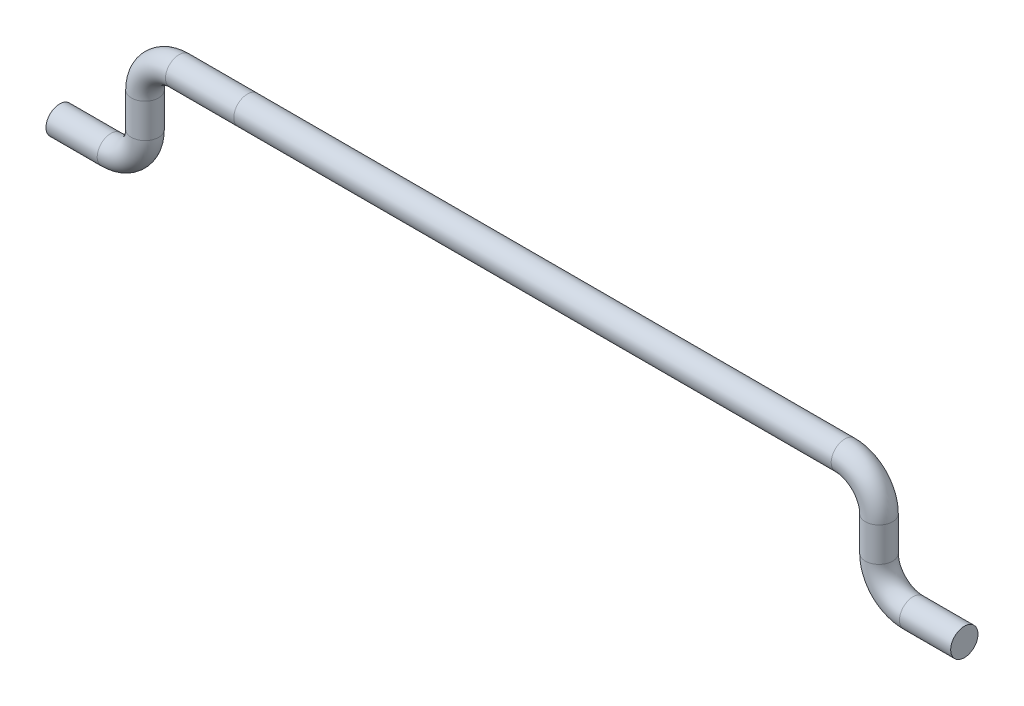
ISO-10303-21;
HEADER;
FILE_DESCRIPTION(('STEP AP214'),'2;1');
FILE_NAME('part.step','',(''),(''),'','','');
FILE_SCHEMA(('AUTOMOTIVE_DESIGN { 1 0 10303 214 1 1 1 1 }'));
ENDSEC;
DATA;
#1=APPLICATION_CONTEXT('core data for automotive mechanical design processes');
#2=APPLICATION_PROTOCOL_DEFINITION('international standard','automotive_design',2000,#1);
#3=PRODUCT_CONTEXT('',#1,'mechanical');
#4=PRODUCT('Part','Part','',(#3));
#5=PRODUCT_RELATED_PRODUCT_CATEGORY('part','',(#4));
#6=PRODUCT_DEFINITION_FORMATION('','',#4);
#7=PRODUCT_DEFINITION_CONTEXT('part definition',#1,'design');
#8=PRODUCT_DEFINITION('design','',#6,#7);
#9=PRODUCT_DEFINITION_SHAPE('','',#8);
#10=(LENGTH_UNIT() NAMED_UNIT(*) SI_UNIT(.MILLI.,.METRE.));
#11=(NAMED_UNIT(*) PLANE_ANGLE_UNIT() SI_UNIT($,.RADIAN.));
#12=(NAMED_UNIT(*) SI_UNIT($,.STERADIAN.) SOLID_ANGLE_UNIT());
#13=UNCERTAINTY_MEASURE_WITH_UNIT(LENGTH_MEASURE(1.E-05),#10,'distance_accuracy_value','');
#14=(GEOMETRIC_REPRESENTATION_CONTEXT(3) GLOBAL_UNCERTAINTY_ASSIGNED_CONTEXT((#13)) GLOBAL_UNIT_ASSIGNED_CONTEXT((#10,
#11,#12)) REPRESENTATION_CONTEXT('',''));
#15=CARTESIAN_POINT('',(0.,0.,0.));
#16=DIRECTION('',(0.,0.,1.));
#17=DIRECTION('',(1.,0.,0.));
#18=AXIS2_PLACEMENT_3D('',#15,#16,#17);
#19=CARTESIAN_POINT('',(15.0190459051359,-7.62,0.));
#20=DIRECTION('',(1.,0.,0.));
#21=DIRECTION('',(0.,0.,-1.));
#22=AXIS2_PLACEMENT_3D('',#19,#20,#21);
#23=PLANE('',#22);
#24=CARTESIAN_POINT('',(15.0190459051359,-7.62,0.));
#25=DIRECTION('',(1.,0.,0.));
#26=DIRECTION('',(0.,0.,-1.));
#27=AXIS2_PLACEMENT_3D('',#24,#25,#26);
#28=CIRCLE('',#27,1.016);
#29=CARTESIAN_POINT('',(15.0190459051359,-7.62,-1.016));
#30=VERTEX_POINT('',#29);
#31=EDGE_CURVE('E102',#30,#30,#28,.T.);
#32=ORIENTED_EDGE('',*,*,#31,.T.);
#33=EDGE_LOOP('',(#32));
#34=FACE_BOUND('',#33,.T.);
#35=ADVANCED_FACE('F55',(#34),#23,.T.);
#36=CARTESIAN_POINT('',(-52.2909540948641,-7.62000000000001,0.));
#37=DIRECTION('',(1.,0.,0.));
#38=DIRECTION('',(0.,0.,-1.));
#39=AXIS2_PLACEMENT_3D('',#36,#37,#38);
#40=PLANE('',#39);
#41=CARTESIAN_POINT('',(-52.2909540948641,-7.62000000000001,0.));
#42=DIRECTION('',(1.,0.,0.));
#43=DIRECTION('',(0.,0.,-1.));
#44=AXIS2_PLACEMENT_3D('',#41,#42,#43);
#45=CIRCLE('',#44,1.016);
#46=CARTESIAN_POINT('',(-52.2909540948641,-7.62000000000001,-1.016));
#47=VERTEX_POINT('',#46);
#48=EDGE_CURVE('E11',#47,#47,#45,.T.);
#49=ORIENTED_EDGE('',*,*,#48,.F.);
#50=EDGE_LOOP('',(#49));
#51=FACE_BOUND('',#50,.T.);
#52=ADVANCED_FACE('F111',(#51),#40,.F.);
#53=CARTESIAN_POINT('',(15.0190459051359,-7.62,0.));
#54=DIRECTION('',(-1.,0.,0.));
#55=DIRECTION('',(0.,-1.,0.));
#56=AXIS2_PLACEMENT_3D('',#53,#54,#55);
#57=CYLINDRICAL_SURFACE('',#56,1.016);
#58=CARTESIAN_POINT('',(11.2090459051359,-7.62,0.));
#59=DIRECTION('',(1.,0.,0.));
#60=DIRECTION('',(0.,0.,-1.));
#61=AXIS2_PLACEMENT_3D('',#58,#59,#60);
#62=CIRCLE('',#61,1.016);
#63=CARTESIAN_POINT('',(11.2090459051359,-8.63600000000001,0.));
#64=VERTEX_POINT('',#63);
#65=EDGE_CURVE('E98',#64,#64,#62,.T.);
#66=ORIENTED_EDGE('',*,*,#65,.T.);
#67=EDGE_LOOP('',(#66));
#68=FACE_BOUND('',#67,.T.);
#69=ORIENTED_EDGE('',*,*,#31,.F.);
#70=EDGE_LOOP('',(#69));
#71=FACE_BOUND('',#70,.T.);
#72=ADVANCED_FACE('F108',(#68,#71),#57,.T.);
#73=CARTESIAN_POINT('',(11.2090459051359,-5.08,0.));
#74=DIRECTION('',(0.,0.,-1.));
#75=DIRECTION('',(-1.,0.,0.));
#76=AXIS2_PLACEMENT_3D('',#73,#74,#75);
#77=TOROIDAL_SURFACE('',#76,2.54000000000001,1.016);
#78=CARTESIAN_POINT('',(8.66904590513586,-5.08,0.));
#79=DIRECTION('',(0.,-1.,0.));
#80=DIRECTION('',(0.,0.,-1.));
#81=AXIS2_PLACEMENT_3D('',#78,#79,#80);
#82=CIRCLE('',#81,1.016);
#83=CARTESIAN_POINT('',(7.65304590513585,-5.08,0.));
#84=VERTEX_POINT('',#83);
#85=EDGE_CURVE('E94',#84,#84,#82,.T.);
#86=CARTESIAN_POINT('',(11.2090459051359,-5.08,0.));
#87=DIRECTION('',(0.,0.,-1.));
#88=DIRECTION('',(-1.,0.,0.));
#89=AXIS2_PLACEMENT_3D('',#86,#87,#88);
#90=CIRCLE('',#89,3.55600000000001);
#91=EDGE_CURVE('',#64,#84,#90,.T.);
#92=ORIENTED_EDGE('',*,*,#65,.F.);
#93=ORIENTED_EDGE('',*,*,#85,.T.);
#94=ORIENTED_EDGE('',*,*,#91,.T.);
#95=ORIENTED_EDGE('',*,*,#91,.F.);
#96=EDGE_LOOP('',(#92,#94,#93,#95));
#97=FACE_BOUND('',#96,.T.);
#98=ADVANCED_FACE('F110',(#97),#77,.T.);
#99=CARTESIAN_POINT('',(8.66904590513586,-5.08,0.));
#100=DIRECTION('',(0.,1.,0.));
#101=DIRECTION('',(0.,0.,1.));
#102=AXIS2_PLACEMENT_3D('',#99,#100,#101);
#103=CYLINDRICAL_SURFACE('',#102,1.016);
#104=CARTESIAN_POINT('',(8.66904590513586,-2.54,0.));
#105=DIRECTION('',(0.,-1.,0.));
#106=DIRECTION('',(0.,0.,-1.));
#107=AXIS2_PLACEMENT_3D('',#104,#105,#106);
#108=CIRCLE('',#107,1.016);
#109=CARTESIAN_POINT('',(9.68504590513586,-2.54,0.));
#110=VERTEX_POINT('',#109);
#111=EDGE_CURVE('E90',#110,#110,#108,.T.);
#112=ORIENTED_EDGE('',*,*,#111,.T.);
#113=EDGE_LOOP('',(#112));
#114=FACE_BOUND('',#113,.T.);
#115=ORIENTED_EDGE('',*,*,#85,.F.);
#116=EDGE_LOOP('',(#115));
#117=FACE_BOUND('',#116,.T.);
#118=ADVANCED_FACE('F118',(#114,#117),#103,.T.);
#119=CARTESIAN_POINT('',(6.12904590513586,-2.54,0.));
#120=DIRECTION('',(0.,0.,1.));
#121=DIRECTION('',(1.,0.,0.));
#122=AXIS2_PLACEMENT_3D('',#119,#120,#121);
#123=TOROIDAL_SURFACE('',#122,2.54,1.016);
#124=CARTESIAN_POINT('',(6.12904590513586,0.,0.));
#125=DIRECTION('',(1.,0.,0.));
#126=DIRECTION('',(0.,0.,-1.));
#127=AXIS2_PLACEMENT_3D('',#124,#125,#126);
#128=CIRCLE('',#127,1.016);
#129=CARTESIAN_POINT('',(6.12904590513586,1.016,0.));
#130=VERTEX_POINT('',#129);
#131=EDGE_CURVE('E86',#130,#130,#128,.T.);
#132=CARTESIAN_POINT('',(6.12904590513586,-2.54,0.));
#133=DIRECTION('',(0.,0.,1.));
#134=DIRECTION('',(1.,0.,0.));
#135=AXIS2_PLACEMENT_3D('',#132,#133,#134);
#136=CIRCLE('',#135,3.556);
#137=EDGE_CURVE('',#110,#130,#136,.T.);
#138=ORIENTED_EDGE('',*,*,#111,.F.);
#139=ORIENTED_EDGE('',*,*,#131,.T.);
#140=ORIENTED_EDGE('',*,*,#137,.T.);
#141=ORIENTED_EDGE('',*,*,#137,.F.);
#142=EDGE_LOOP('',(#138,#140,#139,#141));
#143=FACE_BOUND('',#142,.T.);
#144=ADVANCED_FACE('F147',(#143),#123,.T.);
#145=CARTESIAN_POINT('',(6.12904590513586,0.,0.));
#146=DIRECTION('',(-1.,0.,0.));
#147=DIRECTION('',(0.,-1.,0.));
#148=AXIS2_PLACEMENT_3D('',#145,#146,#147);
#149=CYLINDRICAL_SURFACE('',#148,1.016);
#150=CARTESIAN_POINT('',(-38.3209540948641,0.,0.));
#151=DIRECTION('',(1.,0.,0.));
#152=DIRECTION('',(0.,0.,-1.));
#153=AXIS2_PLACEMENT_3D('',#150,#151,#152);
#154=CIRCLE('',#153,1.016);
#155=CARTESIAN_POINT('',(-38.3209540948641,0.,-1.016));
#156=VERTEX_POINT('',#155);
#157=EDGE_CURVE('E82',#156,#156,#154,.T.);
#158=ORIENTED_EDGE('',*,*,#157,.T.);
#159=EDGE_LOOP('',(#158));
#160=FACE_BOUND('',#159,.T.);
#161=ORIENTED_EDGE('',*,*,#131,.F.);
#162=EDGE_LOOP('',(#161));
#163=FACE_BOUND('',#162,.T.);
#164=ADVANCED_FACE('F143',(#160,#163),#149,.T.);
#165=CARTESIAN_POINT('',(-38.3209540948641,0.,0.));
#166=DIRECTION('',(-1.,0.,0.));
#167=DIRECTION('',(0.,0.,1.));
#168=AXIS2_PLACEMENT_3D('',#165,#166,#167);
#169=CYLINDRICAL_SURFACE('',#168,1.016);
#170=CARTESIAN_POINT('',(-43.4009540948641,0.,0.));
#171=DIRECTION('',(1.,0.,0.));
#172=DIRECTION('',(0.,0.,-1.));
#173=AXIS2_PLACEMENT_3D('',#170,#171,#172);
#174=CIRCLE('',#173,1.016);
#175=CARTESIAN_POINT('',(-43.4009540948641,1.0159999999997,0.));
#176=VERTEX_POINT('',#175);
#177=EDGE_CURVE('E78',#176,#176,#174,.T.);
#178=ORIENTED_EDGE('',*,*,#177,.T.);
#179=EDGE_LOOP('',(#178));
#180=FACE_BOUND('',#179,.T.);
#181=ORIENTED_EDGE('',*,*,#157,.F.);
#182=EDGE_LOOP('',(#181));
#183=FACE_BOUND('',#182,.T.);
#184=ADVANCED_FACE('F139',(#180,#183),#169,.T.);
#185=CARTESIAN_POINT('',(-43.4009540948641,-2.54,0.));
#186=DIRECTION('',(0.,0.,1.));
#187=DIRECTION('',(1.,0.,0.));
#188=AXIS2_PLACEMENT_3D('',#185,#186,#187);
#189=TOROIDAL_SURFACE('',#188,2.5399999999997,1.016);
#190=CARTESIAN_POINT('',(-45.9409540948641,-2.54,0.));
#191=DIRECTION('',(0.,1.,0.));
#192=DIRECTION('',(0.,0.,-1.));
#193=AXIS2_PLACEMENT_3D('',#190,#191,#192);
#194=CIRCLE('',#193,1.016);
#195=CARTESIAN_POINT('',(-46.9569540948638,-2.54,0.));
#196=VERTEX_POINT('',#195);
#197=EDGE_CURVE('E72',#196,#196,#194,.T.);
#198=CARTESIAN_POINT('',(-43.4009540948641,-2.54,0.));
#199=DIRECTION('',(0.,0.,1.));
#200=DIRECTION('',(1.,0.,0.));
#201=AXIS2_PLACEMENT_3D('',#198,#199,#200);
#202=CIRCLE('',#201,3.5559999999997);
#203=EDGE_CURVE('',#176,#196,#202,.T.);
#204=ORIENTED_EDGE('',*,*,#177,.F.);
#205=ORIENTED_EDGE('',*,*,#197,.T.);
#206=ORIENTED_EDGE('',*,*,#203,.T.);
#207=ORIENTED_EDGE('',*,*,#203,.F.);
#208=EDGE_LOOP('',(#204,#206,#205,#207));
#209=FACE_BOUND('',#208,.T.);
#210=ADVANCED_FACE('F135',(#209),#189,.T.);
#211=CARTESIAN_POINT('',(-45.9409540948641,-2.54000000000001,0.));
#212=DIRECTION('',(0.,-1.,0.));
#213=DIRECTION('',(0.,0.,-1.));
#214=AXIS2_PLACEMENT_3D('',#211,#212,#213);
#215=CYLINDRICAL_SURFACE('',#214,1.016);
#216=CARTESIAN_POINT('',(-45.9409540948641,-5.07999999999999,0.));
#217=DIRECTION('',(0.,1.,0.));
#218=DIRECTION('',(0.,0.,-1.));
#219=AXIS2_PLACEMENT_3D('',#216,#217,#218);
#220=CIRCLE('',#219,1.016);
#221=CARTESIAN_POINT('',(-44.9249540948641,-5.07999999999998,0.));
#222=VERTEX_POINT('',#221);
#223=EDGE_CURVE('E67',#222,#222,#220,.T.);
#224=ORIENTED_EDGE('',*,*,#223,.T.);
#225=EDGE_LOOP('',(#224));
#226=FACE_BOUND('',#225,.T.);
#227=ORIENTED_EDGE('',*,*,#197,.F.);
#228=EDGE_LOOP('',(#227));
#229=FACE_BOUND('',#228,.T.);
#230=ADVANCED_FACE('F129',(#226,#229),#215,.T.);
#231=CARTESIAN_POINT('',(-48.4809540948641,-5.08000000000001,0.));
#232=DIRECTION('',(0.,0.,-1.));
#233=DIRECTION('',(-1.,0.,0.));
#234=AXIS2_PLACEMENT_3D('',#231,#232,#233);
#235=TOROIDAL_SURFACE('',#234,2.54,1.016);
#236=CARTESIAN_POINT('',(-48.4809540948641,-7.6200000000003,0.));
#237=DIRECTION('',(1.,0.,0.));
#238=DIRECTION('',(0.,0.,-1.));
#239=AXIS2_PLACEMENT_3D('',#236,#237,#238);
#240=CIRCLE('',#239,1.016);
#241=CARTESIAN_POINT('',(-48.4809540948641,-8.63600000000001,0.));
#242=VERTEX_POINT('',#241);
#243=EDGE_CURVE('E62',#242,#242,#240,.T.);
#244=CARTESIAN_POINT('',(-48.4809540948641,-5.08000000000001,0.));
#245=DIRECTION('',(0.,0.,-1.));
#246=DIRECTION('',(-1.,0.,0.));
#247=AXIS2_PLACEMENT_3D('',#244,#245,#246);
#248=CIRCLE('',#247,3.556);
#249=EDGE_CURVE('',#222,#242,#248,.T.);
#250=ORIENTED_EDGE('',*,*,#223,.F.);
#251=ORIENTED_EDGE('',*,*,#243,.T.);
#252=ORIENTED_EDGE('',*,*,#249,.T.);
#253=ORIENTED_EDGE('',*,*,#249,.F.);
#254=EDGE_LOOP('',(#250,#252,#251,#253));
#255=FACE_BOUND('',#254,.T.);
#256=ADVANCED_FACE('F124',(#255),#235,.T.);
#257=CARTESIAN_POINT('',(-48.4809540948642,-7.62000000000001,0.));
#258=DIRECTION('',(-1.,0.,0.));
#259=DIRECTION('',(0.,-1.,0.));
#260=AXIS2_PLACEMENT_3D('',#257,#258,#259);
#261=CYLINDRICAL_SURFACE('',#260,1.016);
#262=ORIENTED_EDGE('',*,*,#48,.T.);
#263=EDGE_LOOP('',(#262));
#264=FACE_BOUND('',#263,.T.);
#265=ORIENTED_EDGE('',*,*,#243,.F.);
#266=EDGE_LOOP('',(#265));
#267=FACE_BOUND('',#266,.T.);
#268=ADVANCED_FACE('F122',(#264,#267),#261,.T.);
#269=CLOSED_SHELL('',(#35,#52,#72,#98,#118,#144,#164,#184,#210,#230,#256,#268));
#270=MANIFOLD_SOLID_BREP('B2',#269);
#271=ADVANCED_BREP_SHAPE_REPRESENTATION('',(#18,#270),#14);
#272=SHAPE_DEFINITION_REPRESENTATION(#9,#271);
ENDSEC;
END-ISO-10303-21;
